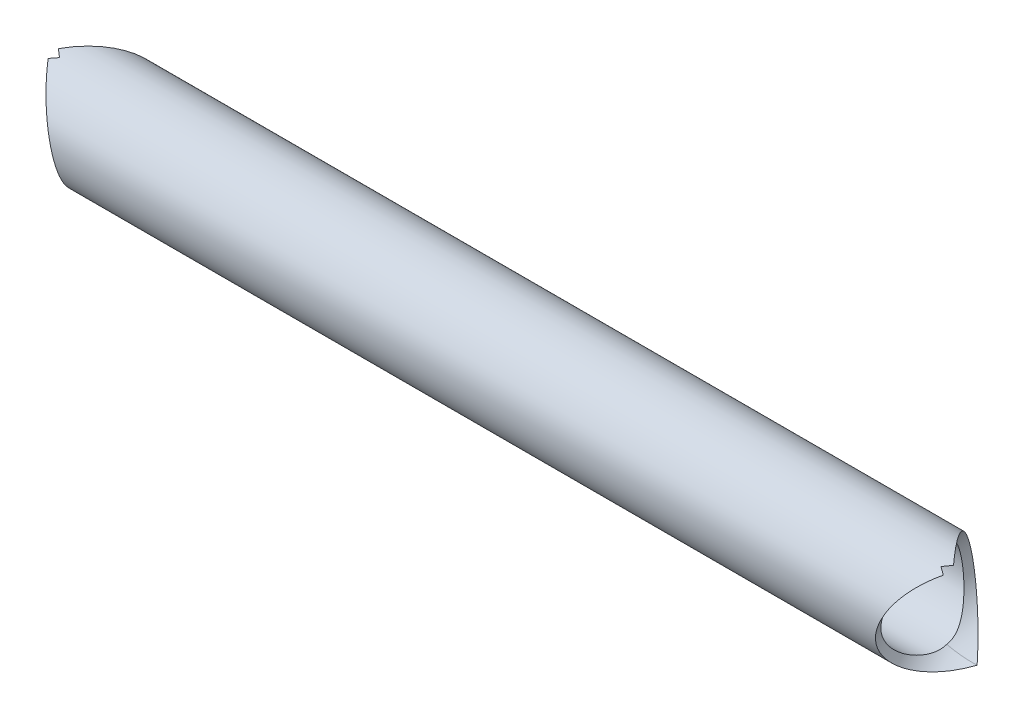
ISO-10303-21;
HEADER;
FILE_DESCRIPTION(('STEP AP214'),'2;1');
FILE_NAME('part.step','',(''),(''),'','','');
FILE_SCHEMA(('AUTOMOTIVE_DESIGN { 1 0 10303 214 1 1 1 1 }'));
ENDSEC;
DATA;
#1=APPLICATION_CONTEXT('core data for automotive mechanical design processes');
#2=APPLICATION_PROTOCOL_DEFINITION('international standard','automotive_design',2000,#1);
#3=PRODUCT_CONTEXT('',#1,'mechanical');
#4=PRODUCT('Part','Part','',(#3));
#5=PRODUCT_RELATED_PRODUCT_CATEGORY('part','',(#4));
#6=PRODUCT_DEFINITION_FORMATION('','',#4);
#7=PRODUCT_DEFINITION_CONTEXT('part definition',#1,'design');
#8=PRODUCT_DEFINITION('design','',#6,#7);
#9=PRODUCT_DEFINITION_SHAPE('','',#8);
#10=(LENGTH_UNIT() NAMED_UNIT(*) SI_UNIT(.MILLI.,.METRE.));
#11=(NAMED_UNIT(*) PLANE_ANGLE_UNIT() SI_UNIT($,.RADIAN.));
#12=(NAMED_UNIT(*) SI_UNIT($,.STERADIAN.) SOLID_ANGLE_UNIT());
#13=UNCERTAINTY_MEASURE_WITH_UNIT(LENGTH_MEASURE(1.E-05),#10,'distance_accuracy_value','');
#14=(GEOMETRIC_REPRESENTATION_CONTEXT(3) GLOBAL_UNCERTAINTY_ASSIGNED_CONTEXT((#13)) GLOBAL_UNIT_ASSIGNED_CONTEXT((#10,
#11,#12)) REPRESENTATION_CONTEXT('',''));
#15=CARTESIAN_POINT('',(0.,0.,0.));
#16=DIRECTION('',(0.,0.,1.));
#17=DIRECTION('',(1.,0.,0.));
#18=AXIS2_PLACEMENT_3D('',#15,#16,#17);
#19=CARTESIAN_POINT('',(80.,380.,-601.037933611912));
#20=DIRECTION('',(-1.,0.,0.));
#21=DIRECTION('',(0.,0.,1.));
#22=AXIS2_PLACEMENT_3D('',#19,#20,#21);
#23=CYLINDRICAL_SURFACE('',#22,7.9);
#24=CARTESIAN_POINT('',(72.565339979956,387.897775618878,-600.850476219786));
#25=CARTESIAN_POINT('',(72.6869299109044,387.894085873587,-600.696784934582));
#26=CARTESIAN_POINT('',(72.8071737259063,387.885963098734,-600.542043881973));
#27=CARTESIAN_POINT('',(73.0435178777138,387.860121883744,-600.229672776898));
#28=CARTESIAN_POINT('',(73.159608097754,387.842381516956,-600.072036921201));
#29=CARTESIAN_POINT('',(73.3878073009582,387.796142987276,-599.750708309881));
#30=CARTESIAN_POINT('',(73.4997958264968,387.767443358215,-599.586957375423));
#31=CARTESIAN_POINT('',(73.7147588032464,387.69832599082,-599.256267217724));
#32=CARTESIAN_POINT('',(73.8177409942675,387.657918445385,-599.08933088528));
#33=CARTESIAN_POINT('',(74.053845941869,387.543706316834,-598.67883738778));
#34=CARTESIAN_POINT('',(74.180730889578,387.463016267592,-598.433379860413));
#35=CARTESIAN_POINT('',(74.3442394259693,387.319715691754,-598.063184351454));
#36=CARTESIAN_POINT('',(74.3941585734484,387.268431318648,-597.939837093442));
#37=CARTESIAN_POINT('',(74.4841346663313,387.158162564856,-597.692941668831));
#38=CARTESIAN_POINT('',(74.5241922754734,387.099178702798,-597.569393516317));
#39=CARTESIAN_POINT('',(74.593894745375,386.972844205923,-597.32189485819));
#40=CARTESIAN_POINT('',(74.6234263223256,386.90541251852,-597.197953658402));
#41=CARTESIAN_POINT('',(74.6710954465946,386.762949718181,-596.952266981842));
#42=CARTESIAN_POINT('',(74.6892331665077,386.687918720381,-596.830521471837));
#43=CARTESIAN_POINT('',(74.7143835532997,386.530596084719,-596.590239371474));
#44=CARTESIAN_POINT('',(74.7213706230622,386.448288197647,-596.471710776601));
#45=CARTESIAN_POINT('',(74.7249648427528,386.277219564913,-596.239251098585));
#46=CARTESIAN_POINT('',(74.7215703181951,386.188457780534,-596.125320760115));
#47=CARTESIAN_POINT('',(74.7041624950976,385.988534487427,-595.882699570695));
#48=CARTESIAN_POINT('',(74.6883339928731,385.87623114821,-595.755082013709));
#49=CARTESIAN_POINT('',(74.6461785943842,385.644596332415,-595.508267733877));
#50=CARTESIAN_POINT('',(74.6198492263524,385.525263206756,-595.389073001437));
#51=CARTESIAN_POINT('',(74.5589091080366,385.280148635157,-595.159302081817));
#52=CARTESIAN_POINT('',(74.5242819234852,385.154354786837,-595.048743582722));
#53=CARTESIAN_POINT('',(74.4488155110817,384.897130272586,-594.836649978933));
#54=CARTESIAN_POINT('',(74.4079744045261,384.765697910576,-594.735117617941));
#55=CARTESIAN_POINT('',(74.3053581313397,384.446334303721,-594.503986828272));
#56=CARTESIAN_POINT('',(74.2415563507208,384.256044479219,-594.37853368835));
#57=CARTESIAN_POINT('',(74.1092897655939,383.866557746636,-594.145088957639));
#58=CARTESIAN_POINT('',(74.0408234628553,383.667357983833,-594.0371030152));
#59=CARTESIAN_POINT('',(73.9022513428122,383.260875337047,-593.838778889976));
#60=CARTESIAN_POINT('',(73.8321453246105,383.053591460502,-593.748442882471));
#61=CARTESIAN_POINT('',(73.692788566501,382.631822586123,-593.585780365181));
#62=CARTESIAN_POINT('',(73.6235377332717,382.417338383691,-593.513451873533));
#63=CARTESIAN_POINT('',(73.4872794966496,381.979845152896,-593.386619416896));
#64=CARTESIAN_POINT('',(73.4203024589128,381.756771172641,-593.332306251973));
#65=CARTESIAN_POINT('',(73.2912313928413,381.305355539989,-593.243129365099));
#66=CARTESIAN_POINT('',(73.2291375343707,381.077013704703,-593.208266319473));
#67=CARTESIAN_POINT('',(73.111548514336,380.616623374222,-593.158635518885));
#68=CARTESIAN_POINT('',(73.0560489114793,380.384577494592,-593.143854167899));
#69=CARTESIAN_POINT('',(72.9530902568205,379.918305807844,-593.134916433191));
#70=CARTESIAN_POINT('',(72.9056304966679,379.684080194692,-593.140758231475));
#71=CARTESIAN_POINT('',(72.822420440664,379.228405796014,-593.172574824271));
#72=CARTESIAN_POINT('',(72.7861661639082,379.006969973278,-593.19741329587));
#73=CARTESIAN_POINT('',(72.7228876045097,378.565702235304,-593.2660204279));
#74=CARTESIAN_POINT('',(72.6958630775911,378.345870277769,-593.309788587265));
#75=CARTESIAN_POINT('',(72.6517555334652,377.909914983149,-593.416132186213));
#76=CARTESIAN_POINT('',(72.6346667179317,377.693789554614,-593.478696624179));
#77=CARTESIAN_POINT('',(72.6108604556306,377.267168646107,-593.62225631782));
#78=CARTESIAN_POINT('',(72.6041419552059,377.056672596308,-593.703249700096));
#79=CARTESIAN_POINT('',(72.6014117661497,376.666489889295,-593.872895339644));
#80=CARTESIAN_POINT('',(72.6042853867914,376.48599269578,-593.959674369562));
#81=CARTESIAN_POINT('',(72.6182832006806,376.132355945857,-594.146539199865));
#82=CARTESIAN_POINT('',(72.6294072344241,375.959216247275,-594.246624742967));
#83=CARTESIAN_POINT('',(72.6596714559278,375.621536127736,-594.459266062398));
#84=CARTESIAN_POINT('',(72.6788110249013,375.456995044083,-594.571820875627));
#85=CARTESIAN_POINT('',(72.7247112302443,375.137561536829,-594.808470973665));
#86=CARTESIAN_POINT('',(72.7514720481018,374.98266934311,-594.932566533252));
#87=CARTESIAN_POINT('',(72.8116859002463,374.685357062202,-595.189626445598));
#88=CARTESIAN_POINT('',(72.8450487369807,374.542802533597,-595.322456696643));
#89=CARTESIAN_POINT('',(72.9180509064701,374.268618659485,-595.597438839815));
#90=CARTESIAN_POINT('',(72.9576926670695,374.136993570147,-595.739594325184));
#91=CARTESIAN_POINT('',(73.042484618842,373.885325429509,-596.032139850253));
#92=CARTESIAN_POINT('',(73.0876323741316,373.765277298286,-596.182526232443));
#93=CARTESIAN_POINT('',(73.1826242401184,373.537089685402,-596.490675636039));
#94=CARTESIAN_POINT('',(73.2324688024465,373.428951351123,-596.648439366093));
#95=CARTESIAN_POINT('',(73.3405752166729,373.215742539681,-596.984911037956));
#96=CARTESIAN_POINT('',(73.3991911166869,373.111814259165,-597.164229301132));
#97=CARTESIAN_POINT('',(73.5196068505902,372.918726675547,-597.529618319317));
#98=CARTESIAN_POINT('',(73.5814068872557,372.82956831457,-597.715689504151));
#99=CARTESIAN_POINT('',(73.7068818545125,372.666031924339,-598.094207096738));
#100=CARTESIAN_POINT('',(73.770561100557,372.5916915439,-598.286668329915));
#101=CARTESIAN_POINT('',(73.8979532567092,372.458278907267,-598.676800582867));
#102=CARTESIAN_POINT('',(73.9616661677088,372.399207078234,-598.874471748228));
#103=CARTESIAN_POINT('',(74.0945266895082,372.290542988237,-599.297956229292));
#104=CARTESIAN_POINT('',(74.163432278787,372.24288249315,-599.524345301826));
#105=CARTESIAN_POINT('',(74.2954378364635,372.167418759999,-599.982223770298));
#106=CARTESIAN_POINT('',(74.35853524481,372.139624242024,-600.213715360063));
#107=CARTESIAN_POINT('',(74.4743483247709,372.104664969187,-600.679959745158));
#108=CARTESIAN_POINT('',(74.5271018338496,372.09742366962,-600.914697159772));
#109=CARTESIAN_POINT('',(74.6170583563405,372.104187072511,-601.386774119734));
#110=CARTESIAN_POINT('',(74.6542795168394,372.118166892353,-601.624110294104));
#111=CARTESIAN_POINT('',(74.6953164737279,372.156986633088,-601.994529357397));
#112=CARTESIAN_POINT('',(74.7066242007866,372.174355808814,-602.127599436923));
#113=CARTESIAN_POINT('',(74.7212510250482,372.215940496217,-602.393088960819));
#114=CARTESIAN_POINT('',(74.7245733006752,372.240153279664,-602.525508643115));
#115=CARTESIAN_POINT('',(74.7222494196527,372.295246567613,-602.788589918926));
#116=CARTESIAN_POINT('',(74.7166227135727,372.326112485577,-602.919254704566));
#117=CARTESIAN_POINT('',(74.6957410617078,372.394249020961,-603.17813555279));
#118=CARTESIAN_POINT('',(74.6804861096904,372.431519642526,-603.306351613788));
#119=CARTESIAN_POINT('',(74.6400214052251,372.512094867482,-603.559636286776));
#120=CARTESIAN_POINT('',(74.6147865418143,372.55541451187,-603.684696106194));
#121=CARTESIAN_POINT('',(74.5545726967703,372.647397756795,-603.930416124384));
#122=CARTESIAN_POINT('',(74.5195936454961,372.696061395524,-604.051076291705));
#123=CARTESIAN_POINT('',(74.4404601849709,372.798151957002,-604.287550213929));
#124=CARTESIAN_POINT('',(74.3962879436272,372.851588020122,-604.403354016477));
#125=CARTESIAN_POINT('',(74.2997546310858,372.96249403678,-604.629504807211));
#126=CARTESIAN_POINT('',(74.2473907533538,373.019965369107,-604.739849908074));
#127=CARTESIAN_POINT('',(74.1099706915978,373.165461656171,-605.004181048868));
#128=CARTESIAN_POINT('',(74.0209210819534,373.255431127254,-605.155024784633));
#129=CARTESIAN_POINT('',(73.8311128719567,373.441372613077,-605.445217450044));
#130=CARTESIAN_POINT('',(73.7303467578017,373.537348461294,-605.584558904246));
#131=CARTESIAN_POINT('',(73.5199106148141,373.734596993366,-605.852751987875));
#132=CARTESIAN_POINT('',(73.4102262583695,373.835878103694,-605.981586044053));
#133=CARTESIAN_POINT('',(73.1845164824843,374.043100375589,-606.229410054409));
#134=CARTESIAN_POINT('',(73.0684934979721,374.149039744717,-606.348403745132));
#135=CARTESIAN_POINT('',(72.8870853454518,374.314967628779,-606.524049923605));
#136=CARTESIAN_POINT('',(72.8233052660836,374.373357240128,-606.58390711638));
#137=CARTESIAN_POINT('',(72.6949329452385,374.491183203199,-606.700953845943));
#138=CARTESIAN_POINT('',(72.6303447660001,374.550614670935,-606.75815274909));
#139=CARTESIAN_POINT('',(72.5653399799563,374.610677408659,-606.814195552516));
#140=B_SPLINE_CURVE_WITH_KNOTS('',3,(#24,#25,#26,#27,#28,#29,#30,#31,#32,#33,#34,#35,#36,#37,
#38,#39,#40,#41,#42,#43,#44,#45,#46,#47,#48,#49,#50,#51,#52,#53,#54,#55,#56,#57,#58,#59,#60,#61,
#62,#63,#64,#65,#66,#67,#68,#69,#70,#71,#72,#73,#74,#75,#76,#77,#78,#79,#80,#81,#82,#83,#84,#85,
#86,#87,#88,#89,#90,#91,#92,#93,#94,#95,#96,#97,#98,#99,#100,#101,#102,#103,#104,#105,#106,#107,
#108,#109,#110,#111,#112,#113,#114,#115,#116,#117,#118,#119,#120,#121,#122,#123,#124,#125,#126,
#127,#128,#129,#130,#131,#132,#133,#134,#135,#136,#137,#138,#139),.UNSPECIFIED.,.F.,.F.,(4,2,2,
2,2,2,2,2,2,2,2,2,2,2,2,2,2,2,2,2,2,2,2,2,2,2,2,2,2,2,2,2,2,2,2,2,2,2,2,2,2,2,2,2,2,2,2,2,2,2,2,
2,2,2,2,2,2,4),(0.,0.58806613767293,1.17747864987231,1.77829308750964,2.37858602036169,
3.23860890160615,3.66597424336923,4.0933108131137,4.52511670400685,4.95691605371785,
5.38970521130266,5.82256417872824,6.33397411293527,6.84550449751899,7.35805649266666,
7.87076376073356,8.57984732067997,9.28915971981359,9.99855948362955,10.7078811381302,
11.4244916944741,12.1411271674916,12.8572772105279,13.5733641242989,14.2496755684299,
14.9259691118304,15.6018675836988,16.2776973775981,16.8778485799508,17.4779881799856,
18.078081458743,18.6781890289776,19.2706028026472,19.8632462041105,20.4556283614313,
21.0480675386878,21.6935672182474,22.3391080562854,22.986268713304,23.6334474736973,
24.3567349949821,25.0803398057028,25.8012461944122,26.5213079440645,26.9249838953893,
27.3284991462207,27.7311385564419,28.1337782272924,28.5374375125611,28.9410996828271,
29.3455522612809,29.7501437138268,30.3399212239228,30.9300790667843,31.521204507793,
32.1121044483394,32.4275707931111,32.7418250057049),.UNSPECIFIED.);
#141=CARTESIAN_POINT('',(74.329032632359,387.331677063429,-598.095738608588));
#142=VERTEX_POINT('',#141);
#143=CARTESIAN_POINT('',(74.704941348177,372.364172236171,-603.063799935522));
#144=VERTEX_POINT('',#143);
#145=EDGE_CURVE('E126',#142,#144,#140,.T.);
#146=ORIENTED_EDGE('',*,*,#145,.T.);
#147=CARTESIAN_POINT('',(72.1531308782195,372.796701036952,-597.794095753919));
#148=CARTESIAN_POINT('',(72.2249773327326,372.751747969605,-597.893929334317));
#149=CARTESIAN_POINT('',(72.2969664053416,372.708906553712,-597.994595195136));
#150=CARTESIAN_POINT('',(72.4409239464359,372.627434784097,-598.197640952346));
#151=CARTESIAN_POINT('',(72.5128924134813,372.58880467516,-598.300020947976));
#152=CARTESIAN_POINT('',(72.7286224831394,372.479054071402,-598.610259019342));
#153=CARTESIAN_POINT('',(72.8718787360456,372.414277971949,-598.820760950131));
#154=CARTESIAN_POINT('',(73.1567988922761,372.300815598285,-599.253649417639));
#155=CARTESIAN_POINT('',(73.2983696119726,372.252487233256,-599.476191271679));
#156=CARTESIAN_POINT('',(73.5724956340595,372.174727321668,-599.929778291516));
#157=CARTESIAN_POINT('',(73.7050610388746,372.14527427645,-600.160813465164));
#158=CARTESIAN_POINT('',(73.9006983775226,372.115275317269,-600.529235549561));
#159=CARTESIAN_POINT('',(73.9688036020187,372.107720283045,-600.663380736287));
#160=CARTESIAN_POINT('',(74.0990416081486,372.09950526666,-600.934704986395));
#161=CARTESIAN_POINT('',(74.1611744379903,372.098845228841,-601.071884025276));
#162=CARTESIAN_POINT('',(74.3357448823034,372.107938807439,-601.486562762943));
#163=CARTESIAN_POINT('',(74.437289439453,372.128616280254,-601.768894524148));
#164=CARTESIAN_POINT('',(74.5519934676474,372.181599751252,-602.177190435836));
#165=CARTESIAN_POINT('',(74.5824864734747,372.20049019012,-602.300228542015));
#166=CARTESIAN_POINT('',(74.6349229298609,372.244460120737,-602.546997409993));
#167=CARTESIAN_POINT('',(74.6568707065249,372.269536470277,-602.670727789054));
#168=CARTESIAN_POINT('',(74.6916537856475,372.325934332726,-602.918041400171));
#169=CARTESIAN_POINT('',(74.7044895531069,372.357255526847,-603.041624639415));
#170=CARTESIAN_POINT('',(74.7208836790695,372.4260387368,-603.287696067555));
#171=CARTESIAN_POINT('',(74.7244417668555,372.46350093179,-603.410184224394));
#172=CARTESIAN_POINT('',(74.7225318286984,372.54419297042,-603.652742057921));
#173=CARTESIAN_POINT('',(74.7170919881815,372.587404415273,-603.772818098677));
#174=CARTESIAN_POINT('',(74.6978656676305,372.6793439988,-604.010176049395));
#175=CARTESIAN_POINT('',(74.6840756769462,372.728074450818,-604.127456762552));
#176=CARTESIAN_POINT('',(74.6314073029442,372.882112964203,-604.474452854707));
#177=CARTESIAN_POINT('',(74.5812351769523,372.995192339393,-604.699095723247));
#178=CARTESIAN_POINT('',(74.4714800214595,373.214033804204,-605.087610523994));
#179=CARTESIAN_POINT('',(74.415904071119,373.316583629006,-605.254531721609));
#180=CARTESIAN_POINT('',(74.294623409607,373.531896865399,-605.57790644392));
#181=CARTESIAN_POINT('',(74.2289126983805,373.644666310866,-605.734353688554));
#182=CARTESIAN_POINT('',(74.0904326490533,373.879813913525,-606.036945785394));
#183=CARTESIAN_POINT('',(74.0176513459316,374.00220828916,-606.183072425169));
#184=CARTESIAN_POINT('',(73.8677043495377,374.255931708398,-606.464867617568));
#185=CARTESIAN_POINT('',(73.7905393678425,374.387259302603,-606.60053785914));
#186=CARTESIAN_POINT('',(73.6296508111655,374.665884080944,-606.86859204019));
#187=CARTESIAN_POINT('',(73.5457984192863,374.813661000512,-607.000399551754));
#188=CARTESIAN_POINT('',(73.3775432823166,375.118489729425,-607.25242998112));
#189=CARTESIAN_POINT('',(73.293140522227,375.275541792493,-607.37265258178));
#190=CARTESIAN_POINT('',(73.1254983216511,375.598664001612,-607.601271864384));
#191=CARTESIAN_POINT('',(73.0422590280533,375.764735273644,-607.70966706466));
#192=CARTESIAN_POINT('',(72.8784955731073,376.105550612242,-607.914179655149));
#193=CARTESIAN_POINT('',(72.7979714122451,376.280294680361,-608.010297043165));
#194=CARTESIAN_POINT('',(72.6244894828675,376.675837634191,-608.208614654318));
#195=CARTESIAN_POINT('',(72.5324926539929,376.898575057789,-608.307820050024));
#196=CARTESIAN_POINT('',(72.3569337273089,377.355246523143,-608.486112045701));
#197=CARTESIAN_POINT('',(72.2733733575197,377.589182844336,-608.565194528966));
#198=CARTESIAN_POINT('',(72.1170941136044,378.066456488046,-608.701674324988));
#199=CARTESIAN_POINT('',(72.0443602027692,378.309780169415,-608.759101887296));
#200=CARTESIAN_POINT('',(71.911770086891,378.804124235465,-608.85093580934));
#201=CARTESIAN_POINT('',(71.8519078728278,379.055140965917,-608.885352927166));
#202=CARTESIAN_POINT('',(71.7616833923789,379.491199758414,-608.923662129632));
#203=CARTESIAN_POINT('',(71.7277555948322,379.675011798297,-608.933406416558));
#204=CARTESIAN_POINT('',(71.6681578725756,380.044186792736,-608.939965375325));
#205=CARTESIAN_POINT('',(71.6424862156671,380.229549413584,-608.936782761235));
#206=CARTESIAN_POINT('',(71.5999000558952,380.60047471864,-608.917267499699));
#207=CARTESIAN_POINT('',(71.5829800566886,380.786037203758,-608.900943122246));
#208=CARTESIAN_POINT('',(71.5582059384565,381.156148916278,-608.855099900177));
#209=CARTESIAN_POINT('',(71.5503521794784,381.34069810315,-608.825580531614));
#210=CARTESIAN_POINT('',(71.5438673188699,381.707644769303,-608.75343494659));
#211=CARTESIAN_POINT('',(71.5452488549026,381.890038957849,-608.710790846229));
#212=CARTESIAN_POINT('',(71.5572358700194,382.251051993376,-608.612743928198));
#213=CARTESIAN_POINT('',(71.5678412975235,382.429670861463,-608.557341181875));
#214=CARTESIAN_POINT('',(71.5980649821525,382.781893984195,-608.434275834364));
#215=CARTESIAN_POINT('',(71.6176854875045,382.955496976469,-608.366610177537));
#216=CARTESIAN_POINT('',(71.6655543235955,383.296489385146,-608.219690069951));
#217=CARTESIAN_POINT('',(71.6938027096778,383.463878761685,-608.140435544857));
#218=CARTESIAN_POINT('',(71.7580064264407,383.789480334729,-607.972125970731));
#219=CARTESIAN_POINT('',(71.7938648990878,383.947778741954,-607.883200369069));
#220=CARTESIAN_POINT('',(71.8728755145557,384.256618793076,-607.695550291032));
#221=CARTESIAN_POINT('',(71.9160302300634,384.407157676416,-607.5968223634));
#222=CARTESIAN_POINT('',(72.0089054944243,384.69975781144,-607.390438677829));
#223=CARTESIAN_POINT('',(72.0586237928466,384.8418219447,-607.282785984575));
#224=CARTESIAN_POINT('',(72.163896553899,385.11712160493,-607.059272309951));
#225=CARTESIAN_POINT('',(72.2194531191093,385.250353922864,-606.943408376329));
#226=CARTESIAN_POINT('',(72.3421689284406,385.522180947334,-606.690697792268));
#227=CARTESIAN_POINT('',(72.4099297103574,385.659676161876,-606.552960446513));
#228=CARTESIAN_POINT('',(72.550568256047,385.923021355185,-606.269120912615));
#229=CARTESIAN_POINT('',(72.6234482050994,386.048866306877,-606.123015157121));
#230=CARTESIAN_POINT('',(72.7731946274859,386.288797122011,-605.823113522314));
#231=CARTESIAN_POINT('',(72.8500650717465,386.402870921311,-605.669309988651));
#232=CARTESIAN_POINT('',(73.0064827006826,386.619010503283,-605.354775167584));
#233=CARTESIAN_POINT('',(73.0860301758842,386.721074977197,-605.194043127726));
#234=CARTESIAN_POINT('',(73.2609754614665,386.930464621641,-604.83648616789));
#235=CARTESIAN_POINT('',(73.3566387455951,387.035404655512,-604.638389712513));
#236=CARTESIAN_POINT('',(73.5473840497112,387.228225314449,-604.233716184052));
#237=CARTESIAN_POINT('',(73.6424658810037,387.316100659466,-604.027136510019));
#238=CARTESIAN_POINT('',(73.8290198133553,387.474353034142,-603.605931410048));
#239=CARTESIAN_POINT('',(73.92049416823,387.54474113968,-603.391311176404));
#240=CARTESIAN_POINT('',(74.0961303569642,387.66742446581,-602.954218512332));
#241=CARTESIAN_POINT('',(74.1802964034952,387.719730162049,-602.731750710828));
#242=CARTESIAN_POINT('',(74.3550535290961,387.81537060636,-602.225696859058));
#243=CARTESIAN_POINT('',(74.4425345675498,387.853737128228,-601.939996982058));
#244=CARTESIAN_POINT('',(74.5512327620931,387.887563330915,-601.504343479449));
#245=CARTESIAN_POINT('',(74.5836968527485,387.894887930123,-601.358045763039));
#246=CARTESIAN_POINT('',(74.6394961984484,387.901328604198,-601.063571718262));
#247=CARTESIAN_POINT('',(74.6628371868348,387.900449843072,-600.915396630364));
#248=CARTESIAN_POINT('',(74.6961982222738,387.890983098981,-600.639782115688));
#249=CARTESIAN_POINT('',(74.7076670049447,387.88354112776,-600.512478693215));
#250=CARTESIAN_POINT('',(74.7219955631726,387.86243636401,-600.257941159421));
#251=CARTESIAN_POINT('',(74.7248592789202,387.84877642194,-600.130707043056));
#252=CARTESIAN_POINT('',(74.7214627955221,387.815313173038,-599.877239203915));
#253=CARTESIAN_POINT('',(74.7152078368227,387.795513399876,-599.751004948434));
#254=CARTESIAN_POINT('',(74.6934553266787,387.74998428495,-599.500415120403));
#255=CARTESIAN_POINT('',(74.6779575202626,387.724254779622,-599.376059599778));
#256=CARTESIAN_POINT('',(74.6380738275242,387.667304325645,-599.13050678486));
#257=CARTESIAN_POINT('',(74.6137170964071,387.636101562215,-599.00930051234));
#258=CARTESIAN_POINT('',(74.5567559425383,387.568567252235,-598.770283869275));
#259=CARTESIAN_POINT('',(74.5241481138057,387.532233590439,-598.652474923542));
#260=CARTESIAN_POINT('',(74.4151435645427,387.416106499115,-598.304598400421));
#261=CARTESIAN_POINT('',(74.3276048747564,387.329240226894,-598.080305978484));
#262=CARTESIAN_POINT('',(74.1460937186562,387.154570112457,-597.682043958326));
#263=CARTESIAN_POINT('',(74.0551779964132,387.068962381926,-597.505638292928));
#264=CARTESIAN_POINT('',(73.8621130206131,386.887829663526,-597.164288357847));
#265=CARTESIAN_POINT('',(73.7599551798938,386.792297097848,-596.999353008772));
#266=CARTESIAN_POINT('',(73.5476446481354,386.591913839283,-596.679913833987));
#267=CARTESIAN_POINT('',(73.4374703499702,386.487037778036,-596.525440544001));
#268=CARTESIAN_POINT('',(73.2121454311849,386.268680474602,-596.226712190442));
#269=CARTESIAN_POINT('',(73.0969966959002,386.155202480494,-596.082453309326));
#270=CARTESIAN_POINT('',(72.8441586181325,385.899945001775,-595.779973333918));
#271=CARTESIAN_POINT('',(72.7059403508627,385.756618511269,-595.62349509117));
#272=CARTESIAN_POINT('',(72.49825109461,385.533582621786,-595.398741921036));
#273=CARTESIAN_POINT('',(72.42921060537,385.458182458664,-595.325730434545));
#274=CARTESIAN_POINT('',(72.29111364962,385.304531612993,-595.182769508399));
#275=CARTESIAN_POINT('',(72.222057182289,385.226280711355,-595.112820305002));
#276=CARTESIAN_POINT('',(72.1531308782196,385.146594295187,-595.044389822071));
#277=B_SPLINE_CURVE_WITH_KNOTS('',3,(#147,#148,#149,#150,#151,#152,#153,#154,#155,#156,#157,
#158,#159,#160,#161,#162,#163,#164,#165,#166,#167,#168,#169,#170,#171,#172,#173,#174,#175,#176,
#177,#178,#179,#180,#181,#182,#183,#184,#185,#186,#187,#188,#189,#190,#191,#192,#193,#194,#195,
#196,#197,#198,#199,#200,#201,#202,#203,#204,#205,#206,#207,#208,#209,#210,#211,#212,#213,#214,
#215,#216,#217,#218,#219,#220,#221,#222,#223,#224,#225,#226,#227,#228,#229,#230,#231,#232,#233,
#234,#235,#236,#237,#238,#239,#240,#241,#242,#243,#244,#245,#246,#247,#248,#249,#250,#251,#252,
#253,#254,#255,#256,#257,#258,#259,#260,#261,#262,#263,#264,#265,#266,#267,#268,#269,#270,#271,
#272,#273,#274,#275,#276),.UNSPECIFIED.,.F.,.F.,(4,2,2,2,2,2,2,2,2,2,2,2,2,2,2,2,2,2,2,2,2,2,2,
2,2,2,2,2,2,2,2,2,2,2,2,2,2,2,2,2,2,2,2,2,2,2,2,2,2,2,2,2,2,2,2,2,2,2,2,2,2,2,2,2,4),(0.,
0.392823574174318,0.785669969363421,1.5731516895288,2.3768123024472,3.17955592549203,
3.63116386249732,4.08276815391824,4.9802057583088,5.36434200376196,5.74828352285946,
6.13220544738293,6.51613857439253,6.89887133182912,7.28176511326809,8.04826142715659,
8.65841066400484,9.2689225223401,9.88048612140698,10.4919507310156,11.1365485659928,
11.7811640421571,12.4258601795266,13.070556432302,13.8512660803592,14.6321353162965,
15.4119096867911,16.1913192334134,16.7522517688235,17.3130665396029,17.8735286703807,
18.4340130580129,18.9952645745073,19.5565129525103,20.1179013735913,20.6792933957476,
21.2339281663274,21.7887589129579,22.3433999185527,22.898241360339,23.5158739262968,
24.1337717698023,24.7522967292355,25.3708890322674,26.1013212943157,26.8319792032947,
27.5621731494787,28.2919433621607,29.1925882877739,29.6422865402976,30.0917017273356,
30.4754044885399,30.8589315285584,31.2422382448088,31.6255555353851,32.0076225566087,
32.3898475497747,33.1549929919645,33.8025382015203,34.4505815099607,35.1004413008382,
35.7500569162806,36.5091262060738,36.8859531384181,37.2628090924142),.UNSPECIFIED.);
#278=EDGE_CURVE('E117',#144,#142,#277,.T.);
#279=ORIENTED_EDGE('',*,*,#278,.T.);
#280=EDGE_LOOP('',(#146,#279));
#281=FACE_BOUND('',#280,.T.);
#282=CARTESIAN_POINT('',(-72.1531308782198,385.146594295187,-595.044389822071));
#283=CARTESIAN_POINT('',(-72.2249773327327,385.229657145318,-595.11572063566));
#284=CARTESIAN_POINT('',(-72.2969664053417,385.311160927698,-595.188701015954));
#285=CARTESIAN_POINT('',(-72.440923946436,385.471082431944,-595.338000517779));
#286=CARTESIAN_POINT('',(-72.5128924134813,385.549499974251,-595.414319833027));
#287=CARTESIAN_POINT('',(-72.7286224831394,385.780507275326,-595.648688096238));
#288=CARTESIAN_POINT('',(-72.8718787360456,385.928473654925,-595.811822876205));
#289=CARTESIAN_POINT('',(-73.1567988922761,386.214878746701,-596.155680781368));
#290=CARTESIAN_POINT('',(-73.2983696119726,386.353059255181,-596.336696401528));
#291=CARTESIAN_POINT('',(-73.5724956340595,386.615916194351,-596.714445018925));
#292=CARTESIAN_POINT('',(-73.7050610388746,386.740607853515,-596.91115984671));
#293=CARTESIAN_POINT('',(-73.9006983775225,386.924082737467,-597.232051941941));
#294=CARTESIAN_POINT('',(-73.9688036020187,386.987837617455,-597.350319963577));
#295=CARTESIAN_POINT('',(-74.0990416081486,387.110390832161,-597.592528643759));
#296=CARTESIAN_POINT('',(-74.1611744379902,387.169189206887,-597.716469256506));
#297=CARTESIAN_POINT('',(-74.3357448823033,387.336889586678,-598.09583416166));
#298=CARTESIAN_POINT('',(-74.4372894394529,387.437949729349,-598.360268707116));
#299=CARTESIAN_POINT('',(-74.5519934676474,387.563198174249,-598.752474809504));
#300=CARTESIAN_POINT('',(-74.5824864734747,387.598293329789,-598.871904932632));
#301=CARTESIAN_POINT('',(-74.6349229298609,387.663173098391,-599.114018221461));
#302=CARTESIAN_POINT('',(-74.6568707065249,387.692960394456,-599.23669970744));
#303=CARTESIAN_POINT('',(-74.6916537856475,387.746817332566,-599.484579055814));
#304=CARTESIAN_POINT('',(-74.7044895531069,387.770887266336,-599.609776789465));
#305=CARTESIAN_POINT('',(-74.7208836790694,387.813001799927,-599.861786003143));
#306=CARTESIAN_POINT('',(-74.7244417668555,387.831046223913,-599.988597530152));
#307=CARTESIAN_POINT('',(-74.7225318286983,387.860886170806,-600.242477590954));
#308=CARTESIAN_POINT('',(-74.7170919881815,387.87270105456,-600.369544081626));
#309=CARTESIAN_POINT('',(-74.6978656676305,387.890149793205,-600.623487432215));
#310=CARTESIAN_POINT('',(-74.6840756769461,387.895781045513,-600.750364189858));
#311=CARTESIAN_POINT('',(-74.6314073029441,387.903512890817,-601.129935487699));
#312=CARTESIAN_POINT('',(-74.5812351769523,387.896424170188,-601.381333804159));
#313=CARTESIAN_POINT('',(-74.4714800214594,387.863089631136,-601.825995637046));
#314=CARTESIAN_POINT('',(-74.4159040711188,387.841046342152,-602.020657513619));
#315=CARTESIAN_POINT('',(-74.2946234096068,387.783269887736,-602.404835704191));
#316=CARTESIAN_POINT('',(-74.2289126983803,387.747528593976,-602.594348891343));
#317=CARTESIAN_POINT('',(-74.0904326490531,387.662973989774,-602.968122741438));
#318=CARTESIAN_POINT('',(-74.0176513459314,387.614138265984,-603.152373793324));
#319=CARTESIAN_POINT('',(-73.8677043495375,387.50393911674,-603.515196410363));
#320=CARTESIAN_POINT('',(-73.7905393678422,387.442577720335,-603.693768889986));
#321=CARTESIAN_POINT('',(-73.6296508111652,387.303999605691,-604.054713369409));
#322=CARTESIAN_POINT('',(-73.545798419286,387.226103909482,-604.236766929038));
#323=CARTESIAN_POINT('',(-73.3775432823163,387.056998791297,-604.594318813807));
#324=CARTESIAN_POINT('',(-73.2931405222268,386.965789005014,-604.769816959408));
#325=CARTESIAN_POINT('',(-73.1254983216508,386.770185868168,-605.113930532608));
#326=CARTESIAN_POINT('',(-73.042259028053,386.665790869365,-605.28254509622));
#327=CARTESIAN_POINT('',(-72.8784955731069,386.443938255752,-605.612335806407));
#328=CARTESIAN_POINT('',(-72.7979714122447,386.326480638604,-605.773511951651));
#329=CARTESIAN_POINT('',(-72.6244894828672,386.052441832332,-606.120912060855));
#330=CARTESIAN_POINT('',(-72.5324926539926,385.892834616468,-606.305246558583));
#331=CARTESIAN_POINT('',(-72.3569337273086,385.554945474103,-606.660447614975));
#332=CARTESIAN_POINT('',(-72.2733733575194,385.376659736901,-606.831311412905));
#333=CARTESIAN_POINT('',(-72.117094113604,385.002374985886,-607.157390837064));
#334=CARTESIAN_POINT('',(-72.0443602027689,384.80640115855,-607.312628067866));
#335=CARTESIAN_POINT('',(-71.9117700868907,384.397716695814,-607.605521452556));
#336=CARTESIAN_POINT('',(-71.8519078728276,384.185013933765,-607.743185797915));
#337=CARTESIAN_POINT('',(-71.7616833923787,383.806400092146,-607.962882007353));
#338=CARTESIAN_POINT('',(-71.727755594832,383.644085745288,-608.049691395888));
#339=CARTESIAN_POINT('',(-71.6681578725754,383.312567018652,-608.212259936353));
#340=CARTESIAN_POINT('',(-71.642486215667,383.143364092553,-608.288021404393));
#341=CARTESIAN_POINT('',(-71.5999000558951,382.799197936358,-608.427721383969));
#342=CARTESIAN_POINT('',(-71.5829800566885,382.624238395239,-608.491667299819));
#343=CARTESIAN_POINT('',(-71.5582059384564,382.269638863848,-608.607181165184));
#344=CARTESIAN_POINT('',(-71.5503521794783,382.089998687983,-608.658748623048));
#345=CARTESIAN_POINT('',(-71.5438673188699,381.727105969228,-608.749101906963));
#346=CARTESIAN_POINT('',(-71.5452488549026,381.543848818652,-608.787870142332));
#347=CARTESIAN_POINT('',(-71.5572358700193,381.175340111219,-608.852251370203));
#348=CARTESIAN_POINT('',(-71.5678412975235,380.990088565521,-608.877864436268));
#349=CARTESIAN_POINT('',(-71.5980649821526,380.618924925341,-608.91586128026));
#350=CARTESIAN_POINT('',(-71.6176854875045,380.433012677573,-608.928241755611));
#351=CARTESIAN_POINT('',(-71.6655543235956,380.061898047387,-608.939872406961));
#352=CARTESIAN_POINT('',(-71.6938027096779,379.876695669532,-608.939122498733));
#353=CARTESIAN_POINT('',(-71.7580064264408,379.510443137184,-608.924854364301));
#354=CARTESIAN_POINT('',(-71.7938648990879,379.329369836113,-608.911489933889));
#355=CARTESIAN_POINT('',(-71.8728755145558,378.97008991768,-608.872596885978));
#356=CARTESIAN_POINT('',(-71.9160302300635,378.791884335847,-608.847063972024));
#357=CARTESIAN_POINT('',(-72.0089054944244,378.439362184902,-608.784316878235));
#358=CARTESIAN_POINT('',(-72.0586237928468,378.265044306666,-608.747106696148));
#359=CARTESIAN_POINT('',(-72.1638965538992,377.920920662084,-608.661507730578));
#360=CARTESIAN_POINT('',(-72.2194531191095,377.751116549092,-608.613114912233));
#361=CARTESIAN_POINT('',(-72.3421689284408,377.397750186957,-608.499603746964));
#362=CARTESIAN_POINT('',(-72.4099297103577,377.214805674515,-608.433212363452));
#363=CARTESIAN_POINT('',(-72.5505682560473,376.855912901737,-608.287914223441));
#364=CARTESIAN_POINT('',(-72.6234482050996,376.679967680089,-608.209002103751));
#365=CARTESIAN_POINT('',(-72.7731946274862,376.335462848033,-608.039225169802));
#366=CARTESIAN_POINT('',(-72.8500650717468,376.166910914652,-607.948348305819));
#367=CARTESIAN_POINT('',(-73.0064827006829,375.83774152218,-607.755226624961));
#368=CARTESIAN_POINT('',(-73.0860301758845,375.677124928973,-607.652980571447));
#369=CARTESIAN_POINT('',(-73.2609754614668,375.335814932385,-607.418036984693));
#370=CARTESIAN_POINT('',(-73.3566387455954,375.156741885762,-607.283176092234));
#371=CARTESIAN_POINT('',(-73.5473840497116,374.810445656896,-606.998537034788));
#372=CARTESIAN_POINT('',(-73.642465881004,374.643226152431,-606.848754274392));
#373=CARTESIAN_POINT('',(-73.8290198133556,374.321218953523,-606.534479053951));
#374=CARTESIAN_POINT('',(-73.9204941682303,374.16642343239,-606.369995994861));
#375=CARTESIAN_POINT('',(-74.0961303569645,373.869884723946,-606.026243191395));
#376=CARTESIAN_POINT('',(-74.1802964034955,373.728134014459,-605.846982083163));
#377=CARTESIAN_POINT('',(-74.3550535290964,373.426825596184,-605.429308966291));
#378=CARTESIAN_POINT('',(-74.44253456755,373.270869969061,-605.186874950348));
#379=CARTESIAN_POINT('',(-74.5512327620932,373.055405231731,-604.8067261199));
#380=CARTESIAN_POINT('',(-74.5836968527487,372.986703088759,-604.677355771166));
#381=CARTESIAN_POINT('',(-74.6394961984485,372.855934887279,-604.413431306951));
#382=CARTESIAN_POINT('',(-74.6628371868349,372.793864678865,-604.278880505682));
#383=CARTESIAN_POINT('',(-74.6961982222739,372.685502723824,-604.025285027324));
#384=CARTESIAN_POINT('',(-74.7076670049447,372.638230923859,-603.90684972331));
#385=CARTESIAN_POINT('',(-74.7219955631726,372.549349912051,-603.667402583208));
#386=CARTESIAN_POINT('',(-74.7248592789202,372.507738116875,-603.546391951912));
#387=CARTESIAN_POINT('',(-74.721462795522,372.430502003455,-603.302670148846));
#388=CARTESIAN_POINT('',(-74.7152078368226,372.394874259334,-603.179959993915));
#389=CARTESIAN_POINT('',(-74.6934553266786,372.329785277896,-602.933725173645));
#390=CARTESIAN_POINT('',(-74.6779575202624,372.300324210722,-602.810200485928));
#391=CARTESIAN_POINT('',(-74.638073827524,372.247714714094,-602.563681156084));
#392=CARTESIAN_POINT('',(-74.6137170964069,372.224546008083,-602.44068609925));
#393=CARTESIAN_POINT('',(-74.556755942538,372.184293669869,-602.195595120316));
#394=CARTESIAN_POINT('',(-74.5241481138054,372.167212557601,-602.073499591004));
#395=CARTESIAN_POINT('',(-74.4151435645424,372.12477699186,-601.709215636597));
#396=CARTESIAN_POINT('',(-74.327604874756,372.108277470651,-601.469256045024));
#397=CARTESIAN_POINT('',(-74.1460937186558,372.097477799592,-601.034508241484));
#398=CARTESIAN_POINT('',(-74.0551779964127,372.100155444626,-600.838445821505));
#399=CARTESIAN_POINT('',(-73.8621130206124,372.119353878823,-600.452492119646));
#400=CARTESIAN_POINT('',(-73.7599551798931,372.1358853147,-600.26260570068));
#401=CARTESIAN_POINT('',(-73.5476446481346,372.181811854344,-599.888325605488));
#402=CARTESIAN_POINT('',(-73.4374703499694,372.211242885424,-599.703948817493));
#403=CARTESIAN_POINT('',(-73.212145431184,372.282232521419,-599.340797316375));
#404=CARTESIAN_POINT('',(-73.0969966958993,372.323786565419,-599.162020524383));
#405=CARTESIAN_POINT('',(-72.8441586181317,372.426598968729,-598.779816226016));
#406=CARTESIAN_POINT('',(-72.7059403508621,372.489997634821,-598.577310590361));
#407=CARTESIAN_POINT('',(-72.4982510946096,372.596609210322,-598.279161353481));
#408=CARTESIAN_POINT('',(-72.4292106053697,372.633910377983,-598.181056895635));
#409=CARTESIAN_POINT('',(-72.2911136496198,372.712393091793,-597.986411391158));
#410=CARTESIAN_POINT('',(-72.2220571822889,372.753574936569,-597.889870465516));
#411=CARTESIAN_POINT('',(-72.1531308782195,372.796701036952,-597.794095753919));
#412=B_SPLINE_CURVE_WITH_KNOTS('',3,(#282,#283,#284,#285,#286,#287,#288,#289,#290,#291,#292,
#293,#294,#295,#296,#297,#298,#299,#300,#301,#302,#303,#304,#305,#306,#307,#308,#309,#310,#311,
#312,#313,#314,#315,#316,#317,#318,#319,#320,#321,#322,#323,#324,#325,#326,#327,#328,#329,#330,
#331,#332,#333,#334,#335,#336,#337,#338,#339,#340,#341,#342,#343,#344,#345,#346,#347,#348,#349,
#350,#351,#352,#353,#354,#355,#356,#357,#358,#359,#360,#361,#362,#363,#364,#365,#366,#367,#368,
#369,#370,#371,#372,#373,#374,#375,#376,#377,#378,#379,#380,#381,#382,#383,#384,#385,#386,#387,
#388,#389,#390,#391,#392,#393,#394,#395,#396,#397,#398,#399,#400,#401,#402,#403,#404,#405,#406,
#407,#408,#409,#410,#411),.UNSPECIFIED.,.F.,.F.,(4,2,2,2,2,2,2,2,2,2,2,2,2,2,2,2,2,2,2,2,2,2,2,
2,2,2,2,2,2,2,2,2,2,2,2,2,2,2,2,2,2,2,2,2,2,2,2,2,2,2,2,2,2,2,2,2,2,2,2,2,2,2,2,2,4),(0.,
0.392823574174267,0.785669969363296,1.5731516895287,2.376812302447,3.17955592549185,
3.631163862497,4.08276815391797,4.98020575830859,5.36434200376185,5.74828352285941,
6.13220544738282,6.51613857439235,6.89887133182901,7.281765113268,8.04826142715658,
8.65841066400513,9.26892252234021,9.88048612140723,10.4919507310159,11.1365485659933,
11.7811640421576,12.4258601795271,13.0705564323026,13.8512660803598,14.6321353162971,
15.4119096867917,16.191319233414,16.7522517688241,17.3130665396034,17.8735286703813,
18.4340130580135,18.9952645745079,19.556512952511,20.1179013735918,20.6792933957481,
21.233928166328,21.7887589129585,22.3433999185533,22.8982413603395,23.5158739262974,
24.1337717698029,24.752296729236,25.370889032268,26.1013212943163,26.8319792032955,
27.5621731494795,28.2919433621616,29.1925882877746,29.6422865402983,30.0917017273361,
30.4754044885405,30.858931528559,31.2422382448092,31.6255555353858,32.0076225566092,
32.3898475497753,33.1549929919652,33.8025382015211,34.4505815099618,35.1004413008395,
35.7500569162819,36.5091262060744,36.8859531384183,37.2628090924139),.UNSPECIFIED.);
#413=CARTESIAN_POINT('',(-74.329032632359,387.331677063429,-598.095738608588));
#414=VERTEX_POINT('',#413);
#415=CARTESIAN_POINT('',(-74.7049413481767,372.364172236171,-603.063799935522));
#416=VERTEX_POINT('',#415);
#417=EDGE_CURVE('E60',#414,#416,#412,.T.);
#418=ORIENTED_EDGE('',*,*,#417,.T.);
#419=CARTESIAN_POINT('',(-72.5653399799561,374.610677408659,-606.814195552516));
#420=CARTESIAN_POINT('',(-72.6869299109045,374.498298722825,-606.70928770563));
#421=CARTESIAN_POINT('',(-72.8071737259063,374.388082115666,-606.600369973647));
#422=CARTESIAN_POINT('',(-73.0435178777138,374.171868139966,-606.373444892641));
#423=CARTESIAN_POINT('',(-73.159608097754,374.065881009082,-606.255417303909));
#424=CARTESIAN_POINT('',(-73.3878073009582,373.856531487519,-606.007298671192));
#425=CARTESIAN_POINT('',(-73.4997958264968,373.753259532937,-605.877018432319));
#426=CARTESIAN_POINT('',(-73.7147588032463,373.552121931566,-605.605583622116));
#427=CARTESIAN_POINT('',(-73.8177409942674,373.454251669929,-605.464438587825));
#428=CARTESIAN_POINT('',(-74.0538459418689,373.223460943757,-605.106269685614));
#429=CARTESIAN_POINT('',(-74.180730889578,373.093697046374,-604.882838235895));
#430=CARTESIAN_POINT('',(-74.3442394259692,372.91234878895,-604.529719871294));
#431=CARTESIAN_POINT('',(-74.3941585734484,372.854275576589,-604.409419684304));
#432=CARTESIAN_POINT('',(-74.4841346663312,372.743096858525,-604.162932683822));
#433=CARTESIAN_POINT('',(-74.5241922754734,372.68999101864,-604.036746267188));
#434=CARTESIAN_POINT('',(-74.5938947453749,372.58903970145,-603.777854740805));
#435=CARTESIAN_POINT('',(-74.6234263223256,372.541255048699,-603.645095257405));
#436=CARTESIAN_POINT('',(-74.6710954465945,372.452377251109,-603.375357737555));
#437=CARTESIAN_POINT('',(-74.6892331665076,372.411284004915,-603.238379765039));
#438=CARTESIAN_POINT('',(-74.7143835532996,372.336320860442,-602.961131813889));
#439=CARTESIAN_POINT('',(-74.7213706230621,372.302467736075,-602.820855008795));
#440=CARTESIAN_POINT('',(-74.7249648427527,372.242485434945,-602.538535858612));
#441=CARTESIAN_POINT('',(-74.7215703181951,372.216357504953,-602.396493232388));
#442=CARTESIAN_POINT('',(-74.7041624950976,372.167961262265,-602.085861346749));
#443=CARTESIAN_POINT('',(-74.688333992873,372.147253784152,-601.917132329682));
#444=CARTESIAN_POINT('',(-74.6461785943841,372.116801746159,-601.580020108011));
#445=CARTESIAN_POINT('',(-74.6198492263524,372.10705976948,-601.411636994216));
#446=CARTESIAN_POINT('',(-74.5589091080365,372.098301079135,-601.075781200673));
#447=CARTESIAN_POINT('',(-74.5242819234851,372.099305824446,-600.908311010836));
#448=CARTESIAN_POINT('',(-74.4488155110816,372.111803696875,-600.57515646609));
#449=CARTESIAN_POINT('',(-74.4079744045259,372.12330000126,-600.409472667553));
#450=CARTESIAN_POINT('',(-74.3053581313395,372.16287496043,-600.017237562134));
#451=CARTESIAN_POINT('',(-74.2415563507206,372.195618416715,-599.791679202289));
#452=CARTESIAN_POINT('',(-74.1092897655937,372.280071898175,-599.34551335126));
#453=CARTESIAN_POINT('',(-74.0408234628551,372.331788040932,-599.12490748134));
#454=CARTESIAN_POINT('',(-73.902251342812,372.453778376015,-598.689386002041));
#455=CARTESIAN_POINT('',(-73.8321453246102,372.524054853317,-598.474471096868));
#456=CARTESIAN_POINT('',(-73.6927885665007,372.682849909627,-598.051230966425));
#457=CARTESIAN_POINT('',(-73.6235377332714,372.771366479216,-597.842905018196));
#458=CARTESIAN_POINT('',(-73.4872794966494,372.967383319581,-597.431730849089));
#459=CARTESIAN_POINT('',(-73.4203024589126,373.075069317743,-597.228960914556));
#460=CARTESIAN_POINT('',(-73.2912313928411,373.308474208256,-596.832412370693));
#461=CARTESIAN_POINT('',(-73.2291375343705,373.434193727483,-596.638634074237));
#462=CARTESIAN_POINT('',(-73.1115485143357,373.703110679836,-596.261664386458));
#463=CARTESIAN_POINT('',(-73.0560489114791,373.846296216199,-596.078465912756));
#464=CARTESIAN_POINT('',(-72.9530902568203,374.14952620893,-595.7241486249));
#465=CARTESIAN_POINT('',(-72.9056304966677,374.309569178055,-595.553028747338));
#466=CARTESIAN_POINT('',(-72.8224204406638,374.636205438597,-595.233716664123));
#467=CARTESIAN_POINT('',(-72.786166163908,374.801941105929,-595.084778885718));
#468=CARTESIAN_POINT('',(-72.7228876045095,375.146490170877,-594.800683660511));
#469=CARTESIAN_POINT('',(-72.6958630775909,375.325303222234,-594.665525849073));
#470=CARTESIAN_POINT('',(-72.651755533465,375.694516324365,-594.410481411458));
#471=CARTESIAN_POINT('',(-72.6346667179316,375.884909545322,-594.290585910412));
#472=CARTESIAN_POINT('',(-72.6108604556305,376.275724698837,-594.067251405694));
#473=CARTESIAN_POINT('',(-72.6041419552058,376.476145610412,-593.963810731119));
#474=CARTESIAN_POINT('',(-72.6014117661496,376.862232305637,-593.785039224328));
#475=CARTESIAN_POINT('',(-72.6042853867913,377.047037223352,-593.707857754477));
#476=CARTESIAN_POINT('',(-72.6182832006805,377.421699007735,-593.567836459583));
#477=CARTESIAN_POINT('',(-72.629407234424,377.611555776668,-593.504996357313));
#478=CARTESIAN_POINT('',(-72.6596714559277,377.994870983848,-593.394029489258));
#479=CARTESIAN_POINT('',(-72.6788110249013,378.188329142972,-593.345901588212));
#480=CARTESIAN_POINT('',(-72.7247112302442,378.577454982392,-593.264525206179));
#481=CARTESIAN_POINT('',(-72.7514720481017,378.7731227152,-593.23127707958));
#482=CARTESIAN_POINT('',(-72.8116859002463,379.162794940427,-593.179994062891));
#483=CARTESIAN_POINT('',(-72.8450487369807,379.356788594794,-593.161769593527));
#484=CARTESIAN_POINT('',(-72.9180509064701,379.744479174252,-593.139679086815));
#485=CARTESIAN_POINT('',(-72.9576926670694,379.93817595518,-593.135818617731));
#486=CARTESIAN_POINT('',(-73.042484618842,380.324023987234,-593.142224350359));
#487=CARTESIAN_POINT('',(-73.0876323741316,380.516175882009,-593.152484325619));
#488=CARTESIAN_POINT('',(-73.1826242401184,380.898076064322,-593.186804762099));
#489=CARTESIAN_POINT('',(-73.2324688024465,381.08782411872,-593.210866551594));
#490=CARTESIAN_POINT('',(-73.3405752166729,381.480929728026,-593.275202880169));
#491=CARTESIAN_POINT('',(-73.3991911166869,381.683984125127,-593.316736466785));
#492=CARTESIAN_POINT('',(-73.5196068505901,382.085321858551,-593.415326391668));
#493=CARTESIAN_POINT('',(-73.5814068872557,382.283604889834,-593.472383719532));
#494=CARTESIAN_POINT('',(-73.7068818545125,382.675110466942,-593.601778858236));
#495=CARTESIAN_POINT('',(-73.770561100557,382.868319066329,-593.674154652276));
#496=CARTESIAN_POINT('',(-73.8979532567092,383.248480807389,-593.833776571325));
#497=CARTESIAN_POINT('',(-73.9616661677088,383.435433773925,-593.921023112253));
#498=CARTESIAN_POINT('',(-74.0945266895082,383.824065628101,-594.121303595768));
#499=CARTESIAN_POINT('',(-74.163432278787,384.024890745062,-594.236163542451));
#500=CARTESIAN_POINT('',(-74.2954378364635,384.41715356454,-594.484109801481));
#501=CARTESIAN_POINT('',(-74.35853524481,384.608587110368,-594.617204087208));
#502=CARTESIAN_POINT('',(-74.4743483247709,384.980179236289,-594.900973834262));
#503=CARTESIAN_POINT('',(-74.5271018338495,385.160377200118,-595.051581882092));
#504=CARTESIAN_POINT('',(-74.6170583563404,385.508596147863,-595.370401524173));
#505=CARTESIAN_POINT('',(-74.6542795168393,385.676631151391,-595.538592286752));
#506=CARTESIAN_POINT('',(-74.6953164737278,385.927589710896,-595.81379594976));
#507=CARTESIAN_POINT('',(-74.7066242007864,386.015469133167,-595.915218538326));
#508=CARTESIAN_POINT('',(-74.721251025048,386.186191430178,-596.122746538433));
#509=CARTESIAN_POINT('',(-74.724573300675,386.269036296004,-596.228850069703));
#510=CARTESIAN_POINT('',(-74.7222494196525,386.428980758113,-596.444870432401));
#511=CARTESIAN_POINT('',(-74.7166227135725,386.506092434358,-596.554778487086));
#512=CARTESIAN_POINT('',(-74.6957410617076,386.654229324579,-596.777752348305));
#513=CARTESIAN_POINT('',(-74.6804861096903,386.725254534615,-596.890818156882));
#514=CARTESIAN_POINT('',(-74.640021405225,386.86094283421,-597.119366133902));
#515=CARTESIAN_POINT('',(-74.614786541814,386.925589357353,-597.234853696299));
#516=CARTESIAN_POINT('',(-74.55457269677,387.048043344087,-597.466897368523));
#517=CARTESIAN_POINT('',(-74.5195936454959,387.105850758796,-597.583453485981));
#518=CARTESIAN_POINT('',(-74.4404601849707,387.214678650553,-597.816903456232));
#519=CARTESIAN_POINT('',(-74.396287943627,387.265685616502,-597.933797523452));
#520=CARTESIAN_POINT('',(-74.2997546310855,387.360941338461,-598.166972719634));
#521=CARTESIAN_POINT('',(-74.2473907533535,387.405187767937,-598.283253624355));
#522=CARTESIAN_POINT('',(-74.1099706915975,387.505979644495,-598.56764968474));
#523=CARTESIAN_POINT('',(-74.0209210819531,387.558884881672,-598.735129158783));
#524=CARTESIAN_POINT('',(-73.8311128719563,387.652117368636,-599.066932899845));
#525=CARTESIAN_POINT('',(-73.7303467578013,387.692436485193,-599.231255062501));
#526=CARTESIAN_POINT('',(-73.5199106148137,387.761716656291,-599.556884869804));
#527=CARTESIAN_POINT('',(-73.410226258369,387.790658980245,-599.71818713025));
#528=CARTESIAN_POINT('',(-73.1845164824839,387.838091259845,-600.037730537207));
#529=CARTESIAN_POINT('',(-73.0684934979716,387.856585198612,-600.195972827989));
#530=CARTESIAN_POINT('',(-72.8870853454514,387.877535861887,-600.436689907628));
#531=CARTESIAN_POINT('',(-72.8233052660832,387.883449707555,-600.520100078889));
#532=CARTESIAN_POINT('',(-72.6949329452383,387.892588531867,-600.685929438067));
#533=CARTESIAN_POINT('',(-72.6303447659999,387.895823754768,-600.768351202251));
#534=CARTESIAN_POINT('',(-72.5653399799563,387.897775618878,-600.850476219786));
#535=B_SPLINE_CURVE_WITH_KNOTS('',3,(#419,#420,#421,#422,#423,#424,#425,#426,#427,#428,#429,
#430,#431,#432,#433,#434,#435,#436,#437,#438,#439,#440,#441,#442,#443,#444,#445,#446,#447,#448,
#449,#450,#451,#452,#453,#454,#455,#456,#457,#458,#459,#460,#461,#462,#463,#464,#465,#466,#467,
#468,#469,#470,#471,#472,#473,#474,#475,#476,#477,#478,#479,#480,#481,#482,#483,#484,#485,#486,
#487,#488,#489,#490,#491,#492,#493,#494,#495,#496,#497,#498,#499,#500,#501,#502,#503,#504,#505,
#506,#507,#508,#509,#510,#511,#512,#513,#514,#515,#516,#517,#518,#519,#520,#521,#522,#523,#524,
#525,#526,#527,#528,#529,#530,#531,#532,#533,#534),.UNSPECIFIED.,.F.,.F.,(4,2,2,2,2,2,2,2,2,2,2,
2,2,2,2,2,2,2,2,2,2,2,2,2,2,2,2,2,2,2,2,2,2,2,2,2,2,2,2,2,2,2,2,2,2,2,2,2,2,2,2,2,2,2,2,2,2,4),
(0.,0.588066137672739,1.17747864987212,1.77829308750938,2.37858602036134,3.23860890160573,
3.66597424336892,4.09331081311339,4.5251167040065,4.95691605371758,5.38970521130253,
5.82256417872807,6.33397411293509,6.84550449751884,7.35805649266657,7.8707637607336,
8.5798473206801,9.2891597198138,9.99855948362983,10.7078811381304,11.4244916944744,
12.1411271674917,12.8572772105282,13.5733641242992,14.2496755684302,14.9259691118306,
15.601867583699,16.2776973775983,16.877848579951,17.4779881799857,18.0780814587431,
18.6781890289777,19.2706028026474,19.8632462041107,20.4556283614315,21.0480675386879,
21.6935672182476,22.3391080562856,22.9862687133043,23.6334474736975,24.3567349949823,
25.0803398057032,25.8012461944124,26.5213079440647,26.9249838953895,27.3284991462209,
27.731138556442,28.1337782272924,28.5374375125611,28.9410996828269,29.3455522612808,
29.7501437138267,30.3399212239228,30.9300790667844,31.5212045077932,32.1121044483396,
32.427570793111,32.7418250057044),.UNSPECIFIED.);
#536=EDGE_CURVE('E109',#416,#414,#535,.T.);
#537=ORIENTED_EDGE('',*,*,#536,.T.);
#538=EDGE_LOOP('',(#418,#537));
#539=FACE_BOUND('',#538,.T.);
#540=ADVANCED_FACE('F41',(#281,#539),#23,.F.);
#541=CARTESIAN_POINT('',(80.,380.,-601.037933611912));
#542=DIRECTION('',(-1.,0.,0.));
#543=DIRECTION('',(0.,0.,1.));
#544=AXIS2_PLACEMENT_3D('',#541,#542,#543);
#545=CYLINDRICAL_SURFACE('',#544,9.5);
#546=CARTESIAN_POINT('',(80.,380.,-601.037933611912));
#547=DIRECTION('',(-0.585979005484664,-0.331813099101101,0.739275775604833));
#548=DIRECTION('',(-0.81032623376712,0.239947198690751,-0.534599604105032));
#549=AXIS2_PLACEMENT_3D('',#546,#547,#548);
#550=ELLIPSE('',#549,16.2121849265616,9.5);
#551=CARTESIAN_POINT('',(78.7893851879912,388.988626450987,-597.963101173451));
#552=VERTEX_POINT('',#551);
#553=CARTESIAN_POINT('',(80.,388.667027643417,-597.147865254127));
#554=VERTEX_POINT('',#553);
#555=EDGE_CURVE('E106',#552,#554,#550,.F.);
#556=ORIENTED_EDGE('',*,*,#555,.F.);
#557=CARTESIAN_POINT('',(80.,380.,-601.037933611912));
#558=DIRECTION('',(-0.654450726352376,0.164323096965083,-0.738032632463261));
#559=DIRECTION('',(-0.756104653323101,-0.142230800581141,0.638808384877031));
#560=AXIS2_PLACEMENT_3D('',#557,#558,#559);
#561=ELLIPSE('',#560,14.5159896955862,9.5);
#562=CARTESIAN_POINT('',(80.,389.272935932329,-598.973312776281));
#563=VERTEX_POINT('',#562);
#564=EDGE_CURVE('E110',#563,#552,#561,.F.);
#565=ORIENTED_EDGE('',*,*,#564,.F.);
#566=CARTESIAN_POINT('',(80.,380.,-601.037933611912));
#567=DIRECTION('',(-0.756104653323101,-0.142230800581141,0.638808384877031));
#568=DIRECTION('',(-0.654450726352376,0.164323096965083,-0.738032632463261));
#569=AXIS2_PLACEMENT_3D('',#566,#567,#568);
#570=ELLIPSE('',#569,12.5643982724445,9.5);
#571=CARTESIAN_POINT('',(79.2422548179941,370.956779654218,-603.94828853488));
#572=VERTEX_POINT('',#571);
#573=EDGE_CURVE('E113',#572,#563,#570,.F.);
#574=ORIENTED_EDGE('',*,*,#573,.F.);
#575=CARTESIAN_POINT('',(80.,380.,-601.037933611912));
#576=DIRECTION('',(-0.81032623376712,0.239947198690751,-0.534599604105032));
#577=DIRECTION('',(-0.585979005484664,-0.331813099101101,0.739275775604833));
#578=AXIS2_PLACEMENT_3D('',#575,#576,#577);
#579=ELLIPSE('',#578,11.723673261614,9.5);
#580=EDGE_CURVE('E108',#554,#572,#579,.F.);
#581=ORIENTED_EDGE('',*,*,#580,.F.);
#582=EDGE_LOOP('',(#556,#565,#574,#581));
#583=FACE_BOUND('',#582,.T.);
#584=CARTESIAN_POINT('',(-80.,380.,-601.037933611912));
#585=DIRECTION('',(-0.81032623376712,-0.239947198690751,0.534599604105032));
#586=DIRECTION('',(-0.585979005484664,0.331813099101101,-0.739275775604833));
#587=AXIS2_PLACEMENT_3D('',#584,#585,#586);
#588=ELLIPSE('',#587,11.723673261614,9.5);
#589=CARTESIAN_POINT('',(-79.2422548179945,370.956779654218,-603.94828853488));
#590=VERTEX_POINT('',#589);
#591=CARTESIAN_POINT('',(-80.,388.667027643417,-597.147865254127));
#592=VERTEX_POINT('',#591);
#593=EDGE_CURVE('E93',#590,#592,#588,.T.);
#594=ORIENTED_EDGE('',*,*,#593,.F.);
#595=CARTESIAN_POINT('',(-79.9999999999999,380.,-601.037933611912));
#596=DIRECTION('',(-0.756104653323101,0.142230800581141,-0.638808384877031));
#597=DIRECTION('',(-0.654450726352376,-0.164323096965083,0.738032632463261));
#598=AXIS2_PLACEMENT_3D('',#595,#596,#597);
#599=ELLIPSE('',#598,12.5643982724445,9.5);
#600=CARTESIAN_POINT('',(-79.9999999999999,389.272935932329,-598.973312776281));
#601=VERTEX_POINT('',#600);
#602=EDGE_CURVE('E11',#601,#590,#599,.T.);
#603=ORIENTED_EDGE('',*,*,#602,.F.);
#604=CARTESIAN_POINT('',(-79.9999999999999,380.,-601.037933611912));
#605=DIRECTION('',(-0.654450726352376,-0.164323096965083,0.738032632463261));
#606=DIRECTION('',(-0.756104653323101,0.142230800581141,-0.638808384877031));
#607=AXIS2_PLACEMENT_3D('',#604,#605,#606);
#608=ELLIPSE('',#607,14.5159896955862,9.5);
#609=CARTESIAN_POINT('',(-78.7893851879905,388.988626450987,-597.963101173451));
#610=VERTEX_POINT('',#609);
#611=EDGE_CURVE('E52',#610,#601,#608,.T.);
#612=ORIENTED_EDGE('',*,*,#611,.F.);
#613=CARTESIAN_POINT('',(-80.,380.,-601.037933611912));
#614=DIRECTION('',(-0.585979005484664,0.331813099101101,-0.739275775604833));
#615=DIRECTION('',(-0.81032623376712,-0.239947198690751,0.534599604105032));
#616=AXIS2_PLACEMENT_3D('',#613,#614,#615);
#617=ELLIPSE('',#616,16.2121849265616,9.5);
#618=EDGE_CURVE('E95',#592,#610,#617,.T.);
#619=ORIENTED_EDGE('',*,*,#618,.F.);
#620=EDGE_LOOP('',(#594,#603,#612,#619));
#621=FACE_BOUND('',#620,.T.);
#622=ADVANCED_FACE('F101',(#583,#621),#545,.T.);
#623=CARTESIAN_POINT('',(80.,380.,-601.037933611912));
#624=DIRECTION('',(0.313257210262409,-0.388871019636094,0.866400167535647));
#625=DIRECTION('',(0.,-0.912318699307092,-0.409480879766828));
#626=AXIS2_PLACEMENT_3D('',#623,#624,#625);
#627=CYLINDRICAL_SURFACE('',#626,9.5);
#628=CARTESIAN_POINT('',(80.,380.,-601.037933611912));
#629=DIRECTION('',(0.0877040448988902,-0.311824264686693,0.946083309471727));
#630=DIRECTION('',(-0.915766996856784,0.348518707826595,0.199763654759287));
#631=AXIS2_PLACEMENT_3D('',#628,#629,#630);
#632=ELLIPSE('',#631,9.80979244069028,9.5);
#633=EDGE_CURVE('E112',#552,#142,#632,.T.);
#634=ORIENTED_EDGE('',*,*,#633,.F.);
#635=ORIENTED_EDGE('',*,*,#555,.T.);
#636=ORIENTED_EDGE('',*,*,#580,.T.);
#637=EDGE_CURVE('E115',#144,#572,#632,.T.);
#638=ORIENTED_EDGE('',*,*,#637,.F.);
#639=ORIENTED_EDGE('',*,*,#145,.F.);
#640=EDGE_LOOP('',(#634,#635,#636,#638,#639));
#641=FACE_BOUND('',#640,.T.);
#642=ADVANCED_FACE('F138',(#641),#627,.F.);
#643=CARTESIAN_POINT('',(160.,500.,-1140.));
#644=DIRECTION('',(-0.143388493553694,-0.215082740330541,0.966011984774675));
#645=DIRECTION('',(0.,-0.976098519192531,-0.21732850901377));
#646=AXIS2_PLACEMENT_3D('',#643,#644,#645);
#647=CYLINDRICAL_SURFACE('',#646,9.5);
#648=ORIENTED_EDGE('',*,*,#637,.T.);
#649=ORIENTED_EDGE('',*,*,#573,.T.);
#650=ORIENTED_EDGE('',*,*,#564,.T.);
#651=ORIENTED_EDGE('',*,*,#633,.T.);
#652=ORIENTED_EDGE('',*,*,#278,.F.);
#653=EDGE_LOOP('',(#648,#649,#650,#651,#652));
#654=FACE_BOUND('',#653,.T.);
#655=ADVANCED_FACE('F135',(#654),#647,.F.);
#656=CARTESIAN_POINT('',(-225.,200.,-200.));
#657=DIRECTION('',(0.313257210262409,0.388871019636094,-0.866400167535647));
#658=DIRECTION('',(0.,0.912318699307092,0.409480879766828));
#659=AXIS2_PLACEMENT_3D('',#656,#657,#658);
#660=CYLINDRICAL_SURFACE('',#659,9.5);
#661=CARTESIAN_POINT('',(-80.,380.,-601.037933611912));
#662=DIRECTION('',(0.0877040448988902,0.311824264686694,-0.946083309471728));
#663=DIRECTION('',(0.915766996856784,0.348518707826595,0.199763654759287));
#664=AXIS2_PLACEMENT_3D('',#661,#662,#663);
#665=ELLIPSE('',#664,9.80979244069028,9.5);
#666=EDGE_CURVE('E46',#416,#590,#665,.T.);
#667=ORIENTED_EDGE('',*,*,#666,.T.);
#668=ORIENTED_EDGE('',*,*,#593,.T.);
#669=ORIENTED_EDGE('',*,*,#618,.T.);
#670=EDGE_CURVE('E102',#610,#414,#665,.T.);
#671=ORIENTED_EDGE('',*,*,#670,.T.);
#672=ORIENTED_EDGE('',*,*,#536,.F.);
#673=EDGE_LOOP('',(#667,#668,#669,#671,#672));
#674=FACE_BOUND('',#673,.T.);
#675=ADVANCED_FACE('F43',(#674),#660,.F.);
#676=CARTESIAN_POINT('',(-80.,380.,-601.037933611912));
#677=DIRECTION('',(-0.143388493553694,0.215082740330541,-0.966011984774675));
#678=DIRECTION('',(0.,0.976098519192531,0.21732850901377));
#679=AXIS2_PLACEMENT_3D('',#676,#677,#678);
#680=CYLINDRICAL_SURFACE('',#679,9.5);
#681=ORIENTED_EDGE('',*,*,#670,.F.);
#682=ORIENTED_EDGE('',*,*,#611,.T.);
#683=ORIENTED_EDGE('',*,*,#602,.T.);
#684=ORIENTED_EDGE('',*,*,#666,.F.);
#685=ORIENTED_EDGE('',*,*,#417,.F.);
#686=EDGE_LOOP('',(#681,#682,#683,#684,#685));
#687=FACE_BOUND('',#686,.T.);
#688=ADVANCED_FACE('F166',(#687),#680,.F.);
#689=CLOSED_SHELL('',(#540,#622,#642,#655,#675,#688));
#690=MANIFOLD_SOLID_BREP('B2',#689);
#691=ADVANCED_BREP_SHAPE_REPRESENTATION('',(#18,#690),#14);
#692=SHAPE_DEFINITION_REPRESENTATION(#9,#691);
ENDSEC;
END-ISO-10303-21;
